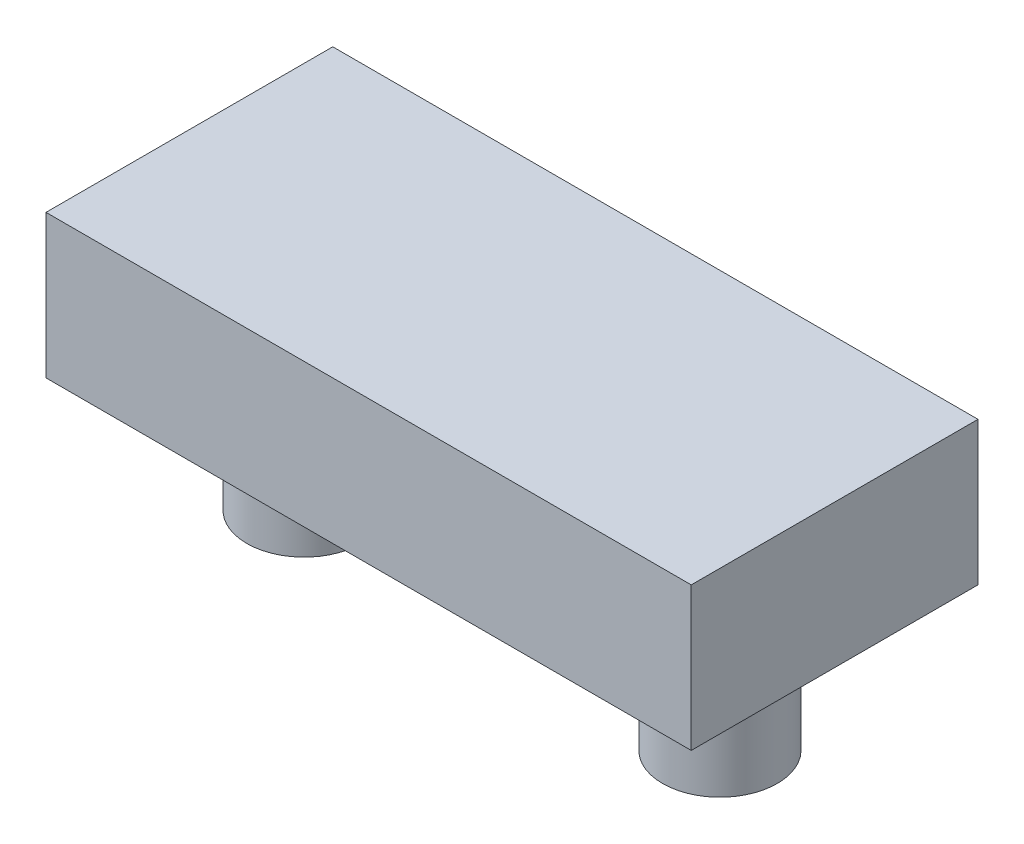
ISO-10303-21;
HEADER;
FILE_DESCRIPTION(('STEP AP214'),'2;1');
FILE_NAME('part.step','',(''),(''),'','','');
FILE_SCHEMA(('AUTOMOTIVE_DESIGN { 1 0 10303 214 1 1 1 1 }'));
ENDSEC;
DATA;
#1=APPLICATION_CONTEXT('core data for automotive mechanical design processes');
#2=APPLICATION_PROTOCOL_DEFINITION('international standard','automotive_design',2000,#1);
#3=PRODUCT_CONTEXT('',#1,'mechanical');
#4=PRODUCT('Part','Part','',(#3));
#5=PRODUCT_RELATED_PRODUCT_CATEGORY('part','',(#4));
#6=PRODUCT_DEFINITION_FORMATION('','',#4);
#7=PRODUCT_DEFINITION_CONTEXT('part definition',#1,'design');
#8=PRODUCT_DEFINITION('design','',#6,#7);
#9=PRODUCT_DEFINITION_SHAPE('','',#8);
#10=(LENGTH_UNIT() NAMED_UNIT(*) SI_UNIT(.MILLI.,.METRE.));
#11=(NAMED_UNIT(*) PLANE_ANGLE_UNIT() SI_UNIT($,.RADIAN.));
#12=(NAMED_UNIT(*) SI_UNIT($,.STERADIAN.) SOLID_ANGLE_UNIT());
#13=UNCERTAINTY_MEASURE_WITH_UNIT(LENGTH_MEASURE(1.E-05),#10,'distance_accuracy_value','');
#14=(GEOMETRIC_REPRESENTATION_CONTEXT(3) GLOBAL_UNCERTAINTY_ASSIGNED_CONTEXT((#13)) GLOBAL_UNIT_ASSIGNED_CONTEXT((#10,
#11,#12)) REPRESENTATION_CONTEXT('',''));
#15=CARTESIAN_POINT('',(0.,0.,0.));
#16=DIRECTION('',(0.,0.,1.));
#17=DIRECTION('',(1.,0.,0.));
#18=AXIS2_PLACEMENT_3D('',#15,#16,#17);
#19=CARTESIAN_POINT('',(0.,640.,200.));
#20=DIRECTION('',(1.,0.,0.));
#21=DIRECTION('',(0.,1.,0.));
#22=AXIS2_PLACEMENT_3D('',#19,#20,#21);
#23=PLANE('',#22);
#24=DIRECTION('',(0.,-1.,0.));
#25=VECTOR('',#24,1.);
#26=CARTESIAN_POINT('',(0.,640.,0.));
#27=LINE('',#26,#25);
#28=CARTESIAN_POINT('',(0.,640.,0.));
#29=VERTEX_POINT('',#28);
#30=CARTESIAN_POINT('',(0.,540.,0.));
#31=VERTEX_POINT('',#30);
#32=EDGE_CURVE('E100',#29,#31,#27,.T.);
#33=ORIENTED_EDGE('',*,*,#32,.T.);
#34=DIRECTION('',(0.,0.,-1.));
#35=VECTOR('',#34,1.);
#36=CARTESIAN_POINT('',(0.,540.,200.));
#37=LINE('',#36,#35);
#38=CARTESIAN_POINT('',(0.,540.,200.));
#39=VERTEX_POINT('',#38);
#40=EDGE_CURVE('E91',#39,#31,#37,.T.);
#41=ORIENTED_EDGE('',*,*,#40,.F.);
#42=DIRECTION('',(0.,-1.,0.));
#43=VECTOR('',#42,1.);
#44=CARTESIAN_POINT('',(0.,640.,200.));
#45=LINE('',#44,#43);
#46=CARTESIAN_POINT('',(0.,640.,200.));
#47=VERTEX_POINT('',#46);
#48=EDGE_CURVE('E85',#47,#39,#45,.T.);
#49=ORIENTED_EDGE('',*,*,#48,.F.);
#50=DIRECTION('',(0.,0.,-1.));
#51=VECTOR('',#50,1.);
#52=CARTESIAN_POINT('',(0.,640.,200.));
#53=LINE('',#52,#51);
#54=EDGE_CURVE('E96',#47,#29,#53,.T.);
#55=ORIENTED_EDGE('',*,*,#54,.T.);
#56=EDGE_LOOP('',(#33,#41,#49,#55));
#57=FACE_BOUND('',#56,.T.);
#58=ADVANCED_FACE('F33',(#57),#23,.F.);
#59=CARTESIAN_POINT('',(0.,540.,200.));
#60=DIRECTION('',(0.,1.,0.));
#61=DIRECTION('',(0.,0.,1.));
#62=AXIS2_PLACEMENT_3D('',#59,#60,#61);
#63=PLANE('',#62);
#64=CARTESIAN_POINT('',(370.,540.,100.));
#65=DIRECTION('',(0.,1.,0.));
#66=DIRECTION('',(0.,0.,1.));
#67=AXIS2_PLACEMENT_3D('',#64,#65,#66);
#68=CIRCLE('',#67,40.);
#69=CARTESIAN_POINT('',(370.,540.,140.));
#70=VERTEX_POINT('',#69);
#71=EDGE_CURVE('E11',#70,#70,#68,.F.);
#72=ORIENTED_EDGE('',*,*,#71,.F.);
#73=EDGE_LOOP('',(#72));
#74=FACE_BOUND('',#73,.T.);
#75=CARTESIAN_POINT('',(80.,540.,100.));
#76=DIRECTION('',(0.,1.,0.));
#77=DIRECTION('',(0.,0.,1.));
#78=AXIS2_PLACEMENT_3D('',#75,#76,#77);
#79=CIRCLE('',#78,40.);
#80=CARTESIAN_POINT('',(80.,540.,140.));
#81=VERTEX_POINT('',#80);
#82=EDGE_CURVE('E41',#81,#81,#79,.F.);
#83=ORIENTED_EDGE('',*,*,#82,.F.);
#84=EDGE_LOOP('',(#83));
#85=FACE_BOUND('',#84,.T.);
#86=DIRECTION('',(1.,0.,0.));
#87=VECTOR('',#86,1.);
#88=CARTESIAN_POINT('',(0.,540.,0.));
#89=LINE('',#88,#87);
#90=CARTESIAN_POINT('',(450.,540.,0.));
#91=VERTEX_POINT('',#90);
#92=EDGE_CURVE('E90',#31,#91,#89,.T.);
#93=ORIENTED_EDGE('',*,*,#92,.T.);
#94=DIRECTION('',(0.,0.,-1.));
#95=VECTOR('',#94,1.);
#96=CARTESIAN_POINT('',(450.,540.,200.));
#97=LINE('',#96,#95);
#98=CARTESIAN_POINT('',(450.,540.,200.));
#99=VERTEX_POINT('',#98);
#100=EDGE_CURVE('E88',#99,#91,#97,.T.);
#101=ORIENTED_EDGE('',*,*,#100,.F.);
#102=DIRECTION('',(1.,0.,0.));
#103=VECTOR('',#102,1.);
#104=CARTESIAN_POINT('',(0.,540.,200.));
#105=LINE('',#104,#103);
#106=EDGE_CURVE('E80',#39,#99,#105,.T.);
#107=ORIENTED_EDGE('',*,*,#106,.F.);
#108=ORIENTED_EDGE('',*,*,#40,.T.);
#109=EDGE_LOOP('',(#93,#101,#107,#108));
#110=FACE_BOUND('',#109,.T.);
#111=ADVANCED_FACE('F89',(#74,#85,#110),#63,.F.);
#112=CARTESIAN_POINT('',(450.,640.,200.));
#113=DIRECTION('',(-1.,0.,0.));
#114=DIRECTION('',(0.,0.,1.));
#115=AXIS2_PLACEMENT_3D('',#112,#113,#114);
#116=PLANE('',#115);
#117=DIRECTION('',(0.,1.,0.));
#118=VECTOR('',#117,1.);
#119=CARTESIAN_POINT('',(450.,640.,0.));
#120=LINE('',#119,#118);
#121=CARTESIAN_POINT('',(450.,640.,0.));
#122=VERTEX_POINT('',#121);
#123=EDGE_CURVE('E66',#91,#122,#120,.T.);
#124=ORIENTED_EDGE('',*,*,#123,.T.);
#125=DIRECTION('',(0.,0.,-1.));
#126=VECTOR('',#125,1.);
#127=CARTESIAN_POINT('',(450.,640.,200.));
#128=LINE('',#127,#126);
#129=CARTESIAN_POINT('',(450.,640.,200.));
#130=VERTEX_POINT('',#129);
#131=EDGE_CURVE('E92',#130,#122,#128,.T.);
#132=ORIENTED_EDGE('',*,*,#131,.F.);
#133=DIRECTION('',(0.,1.,0.));
#134=VECTOR('',#133,1.);
#135=CARTESIAN_POINT('',(450.,640.,200.));
#136=LINE('',#135,#134);
#137=EDGE_CURVE('E83',#99,#130,#136,.T.);
#138=ORIENTED_EDGE('',*,*,#137,.F.);
#139=ORIENTED_EDGE('',*,*,#100,.T.);
#140=EDGE_LOOP('',(#124,#132,#138,#139));
#141=FACE_BOUND('',#140,.T.);
#142=ADVANCED_FACE('F94',(#141),#116,.F.);
#143=CARTESIAN_POINT('',(0.,640.,200.));
#144=DIRECTION('',(0.,-1.,0.));
#145=DIRECTION('',(0.,0.,-1.));
#146=AXIS2_PLACEMENT_3D('',#143,#144,#145);
#147=PLANE('',#146);
#148=DIRECTION('',(-1.,0.,0.));
#149=VECTOR('',#148,1.);
#150=CARTESIAN_POINT('',(0.,640.,0.));
#151=LINE('',#150,#149);
#152=EDGE_CURVE('E72',#122,#29,#151,.T.);
#153=ORIENTED_EDGE('',*,*,#152,.T.);
#154=ORIENTED_EDGE('',*,*,#54,.F.);
#155=DIRECTION('',(-1.,0.,0.));
#156=VECTOR('',#155,1.);
#157=CARTESIAN_POINT('',(0.,640.,200.));
#158=LINE('',#157,#156);
#159=EDGE_CURVE('E49',#130,#47,#158,.T.);
#160=ORIENTED_EDGE('',*,*,#159,.F.);
#161=ORIENTED_EDGE('',*,*,#131,.T.);
#162=EDGE_LOOP('',(#153,#154,#160,#161));
#163=FACE_BOUND('',#162,.T.);
#164=ADVANCED_FACE('F121',(#163),#147,.F.);
#165=CARTESIAN_POINT('',(0.,0.,200.));
#166=DIRECTION('',(0.,0.,1.));
#167=DIRECTION('',(1.,0.,0.));
#168=AXIS2_PLACEMENT_3D('',#165,#166,#167);
#169=PLANE('',#168);
#170=ORIENTED_EDGE('',*,*,#48,.T.);
#171=ORIENTED_EDGE('',*,*,#106,.T.);
#172=ORIENTED_EDGE('',*,*,#137,.T.);
#173=ORIENTED_EDGE('',*,*,#159,.T.);
#174=EDGE_LOOP('',(#170,#171,#172,#173));
#175=FACE_BOUND('',#174,.T.);
#176=ADVANCED_FACE('F81',(#175),#169,.T.);
#177=CARTESIAN_POINT('',(0.,0.,0.));
#178=DIRECTION('',(0.,0.,1.));
#179=DIRECTION('',(1.,0.,0.));
#180=AXIS2_PLACEMENT_3D('',#177,#178,#179);
#181=PLANE('',#180);
#182=ORIENTED_EDGE('',*,*,#32,.F.);
#183=ORIENTED_EDGE('',*,*,#152,.F.);
#184=ORIENTED_EDGE('',*,*,#123,.F.);
#185=ORIENTED_EDGE('',*,*,#92,.F.);
#186=EDGE_LOOP('',(#182,#183,#184,#185));
#187=FACE_BOUND('',#186,.T.);
#188=ADVANCED_FACE('F129',(#187),#181,.F.);
#189=CARTESIAN_POINT('',(80.,450.,100.));
#190=DIRECTION('',(0.,1.,0.));
#191=DIRECTION('',(0.,0.,1.));
#192=AXIS2_PLACEMENT_3D('',#189,#190,#191);
#193=CYLINDRICAL_SURFACE('',#192,40.);
#194=CARTESIAN_POINT('',(80.,450.,100.));
#195=DIRECTION('',(0.,-1.,0.));
#196=DIRECTION('',(0.,0.,-1.));
#197=AXIS2_PLACEMENT_3D('',#194,#195,#196);
#198=CIRCLE('',#197,40.);
#199=CARTESIAN_POINT('',(80.,450.,140.));
#200=VERTEX_POINT('',#199);
#201=EDGE_CURVE('E103',#200,#200,#198,.T.);
#202=CARTESIAN_POINT('',(80.,450.,140.));
#203=CARTESIAN_POINT('',(80.,450.9375,140.));
#204=CARTESIAN_POINT('',(80.,451.875,140.));
#205=CARTESIAN_POINT('',(80.,453.75,140.));
#206=CARTESIAN_POINT('',(80.,454.6875,140.));
#207=CARTESIAN_POINT('',(80.,456.5625,140.));
#208=CARTESIAN_POINT('',(80.,457.5,140.));
#209=CARTESIAN_POINT('',(80.,459.375,140.));
#210=CARTESIAN_POINT('',(80.,460.3125,140.));
#211=CARTESIAN_POINT('',(80.,462.1875,140.));
#212=CARTESIAN_POINT('',(80.,463.125,140.));
#213=CARTESIAN_POINT('',(80.,465.,140.));
#214=CARTESIAN_POINT('',(80.,465.9375,140.));
#215=CARTESIAN_POINT('',(80.,467.8125,140.));
#216=CARTESIAN_POINT('',(80.,468.75,140.));
#217=CARTESIAN_POINT('',(80.,470.625,140.));
#218=CARTESIAN_POINT('',(80.,471.5625,140.));
#219=CARTESIAN_POINT('',(80.,473.4375,140.));
#220=CARTESIAN_POINT('',(80.,474.375,140.));
#221=CARTESIAN_POINT('',(80.,476.25,140.));
#222=CARTESIAN_POINT('',(80.,477.1875,140.));
#223=CARTESIAN_POINT('',(80.,479.0625,140.));
#224=CARTESIAN_POINT('',(80.,480.,140.));
#225=CARTESIAN_POINT('',(80.,481.875,140.));
#226=CARTESIAN_POINT('',(80.,482.8125,140.));
#227=CARTESIAN_POINT('',(80.,484.6875,140.));
#228=CARTESIAN_POINT('',(80.,485.625,140.));
#229=CARTESIAN_POINT('',(80.,487.5,140.));
#230=CARTESIAN_POINT('',(80.,488.4375,140.));
#231=CARTESIAN_POINT('',(80.,490.3125,140.));
#232=CARTESIAN_POINT('',(80.,491.25,140.));
#233=CARTESIAN_POINT('',(80.,493.125,140.));
#234=CARTESIAN_POINT('',(80.,494.0625,140.));
#235=CARTESIAN_POINT('',(80.,495.9375,140.));
#236=CARTESIAN_POINT('',(80.,496.875,140.));
#237=CARTESIAN_POINT('',(80.,498.75,140.));
#238=CARTESIAN_POINT('',(80.,499.6875,140.));
#239=CARTESIAN_POINT('',(80.,501.5625,140.));
#240=CARTESIAN_POINT('',(80.,502.5,140.));
#241=CARTESIAN_POINT('',(80.,504.375,140.));
#242=CARTESIAN_POINT('',(80.,505.3125,140.));
#243=CARTESIAN_POINT('',(80.,507.1875,140.));
#244=CARTESIAN_POINT('',(80.,508.125,140.));
#245=CARTESIAN_POINT('',(80.,510.,140.));
#246=CARTESIAN_POINT('',(80.,510.9375,140.));
#247=CARTESIAN_POINT('',(80.,512.8125,140.));
#248=CARTESIAN_POINT('',(80.,513.75,140.));
#249=CARTESIAN_POINT('',(80.,515.625,140.));
#250=CARTESIAN_POINT('',(80.,516.5625,140.));
#251=CARTESIAN_POINT('',(80.,518.4375,140.));
#252=CARTESIAN_POINT('',(80.,519.375,140.));
#253=CARTESIAN_POINT('',(80.,521.25,140.));
#254=CARTESIAN_POINT('',(80.,522.1875,140.));
#255=CARTESIAN_POINT('',(80.,524.0625,140.));
#256=CARTESIAN_POINT('',(80.,525.,140.));
#257=CARTESIAN_POINT('',(80.,526.875,140.));
#258=CARTESIAN_POINT('',(80.,527.8125,140.));
#259=CARTESIAN_POINT('',(80.,529.6875,140.));
#260=CARTESIAN_POINT('',(80.,530.625,140.));
#261=CARTESIAN_POINT('',(80.,532.5,140.));
#262=CARTESIAN_POINT('',(80.,533.4375,140.));
#263=CARTESIAN_POINT('',(80.,535.3125,140.));
#264=CARTESIAN_POINT('',(80.,536.25,140.));
#265=CARTESIAN_POINT('',(80.,538.125,140.));
#266=CARTESIAN_POINT('',(80.,539.0625,140.));
#267=CARTESIAN_POINT('',(80.,540.,140.));
#268=B_SPLINE_CURVE_WITH_KNOTS('',3,(#202,#203,#204,#205,#206,#207,#208,#209,#210,#211,#212,
#213,#214,#215,#216,#217,#218,#219,#220,#221,#222,#223,#224,#225,#226,#227,#228,#229,#230,#231,
#232,#233,#234,#235,#236,#237,#238,#239,#240,#241,#242,#243,#244,#245,#246,#247,#248,#249,#250,
#251,#252,#253,#254,#255,#256,#257,#258,#259,#260,#261,#262,#263,#264,#265,#266,#267),
.UNSPECIFIED.,.F.,.F.,(4,2,2,2,2,2,2,2,2,2,2,2,2,2,2,2,2,2,2,2,2,2,2,2,2,2,2,2,2,2,2,2,4),(0.,
2.81250000000005,5.62500000000005,8.43750000000004,11.25,14.0625,16.875,19.6875,22.5,25.3125,
28.125,30.9375,33.75,36.5625,39.375,42.1875,45.,47.8125,50.6249999999999,53.4374999999999,
56.2499999999999,59.0624999999999,61.8749999999999,64.6874999999999,67.4999999999999,
70.3124999999999,73.1249999999999,75.9374999999999,78.7499999999999,81.5624999999999,
84.3749999999999,87.1874999999999,89.9999999999999),.UNSPECIFIED.);
#269=EDGE_CURVE('BSEAM112',#200,#81,#268,.T.);
#270=ORIENTED_EDGE('',*,*,#201,.F.);
#271=ORIENTED_EDGE('',*,*,#82,.T.);
#272=ORIENTED_EDGE('',*,*,#269,.T.);
#273=ORIENTED_EDGE('',*,*,#269,.F.);
#274=EDGE_LOOP('',(#270,#272,#271,#273));
#275=FACE_BOUND('',#274,.T.);
#276=ADVANCED_FACE('F112',(#275),#193,.T.);
#277=CARTESIAN_POINT('',(80.,450.,100.));
#278=DIRECTION('',(0.,-1.,0.));
#279=DIRECTION('',(0.,0.,-1.));
#280=AXIS2_PLACEMENT_3D('',#277,#278,#279);
#281=PLANE('',#280);
#282=ORIENTED_EDGE('',*,*,#201,.T.);
#283=EDGE_LOOP('',(#282));
#284=FACE_BOUND('',#283,.T.);
#285=ADVANCED_FACE('F137',(#284),#281,.T.);
#286=CARTESIAN_POINT('',(370.,450.,100.));
#287=DIRECTION('',(0.,1.,0.));
#288=DIRECTION('',(0.,0.,1.));
#289=AXIS2_PLACEMENT_3D('',#286,#287,#288);
#290=CYLINDRICAL_SURFACE('',#289,40.);
#291=CARTESIAN_POINT('',(370.,450.,100.));
#292=DIRECTION('',(0.,-1.,0.));
#293=DIRECTION('',(0.,0.,-1.));
#294=AXIS2_PLACEMENT_3D('',#291,#292,#293);
#295=CIRCLE('',#294,40.);
#296=CARTESIAN_POINT('',(370.,450.,140.));
#297=VERTEX_POINT('',#296);
#298=EDGE_CURVE('E153',#297,#297,#295,.T.);
#299=CARTESIAN_POINT('',(370.,450.,140.));
#300=CARTESIAN_POINT('',(370.,450.9375,140.));
#301=CARTESIAN_POINT('',(370.,451.875,140.));
#302=CARTESIAN_POINT('',(370.,453.75,140.));
#303=CARTESIAN_POINT('',(370.,454.6875,140.));
#304=CARTESIAN_POINT('',(370.,456.5625,140.));
#305=CARTESIAN_POINT('',(370.,457.5,140.));
#306=CARTESIAN_POINT('',(370.,459.375,140.));
#307=CARTESIAN_POINT('',(370.,460.3125,140.));
#308=CARTESIAN_POINT('',(370.,462.1875,140.));
#309=CARTESIAN_POINT('',(370.,463.125,140.));
#310=CARTESIAN_POINT('',(370.,465.,140.));
#311=CARTESIAN_POINT('',(370.,465.9375,140.));
#312=CARTESIAN_POINT('',(370.,467.8125,140.));
#313=CARTESIAN_POINT('',(370.,468.75,140.));
#314=CARTESIAN_POINT('',(370.,470.625,140.));
#315=CARTESIAN_POINT('',(370.,471.5625,140.));
#316=CARTESIAN_POINT('',(370.,473.4375,140.));
#317=CARTESIAN_POINT('',(370.,474.375,140.));
#318=CARTESIAN_POINT('',(370.,476.25,140.));
#319=CARTESIAN_POINT('',(370.,477.1875,140.));
#320=CARTESIAN_POINT('',(370.,479.0625,140.));
#321=CARTESIAN_POINT('',(370.,480.,140.));
#322=CARTESIAN_POINT('',(370.,481.875,140.));
#323=CARTESIAN_POINT('',(370.,482.8125,140.));
#324=CARTESIAN_POINT('',(370.,484.6875,140.));
#325=CARTESIAN_POINT('',(370.,485.625,140.));
#326=CARTESIAN_POINT('',(370.,487.5,140.));
#327=CARTESIAN_POINT('',(370.,488.4375,140.));
#328=CARTESIAN_POINT('',(370.,490.3125,140.));
#329=CARTESIAN_POINT('',(370.,491.25,140.));
#330=CARTESIAN_POINT('',(370.,493.125,140.));
#331=CARTESIAN_POINT('',(370.,494.0625,140.));
#332=CARTESIAN_POINT('',(370.,495.9375,140.));
#333=CARTESIAN_POINT('',(370.,496.875,140.));
#334=CARTESIAN_POINT('',(370.,498.75,140.));
#335=CARTESIAN_POINT('',(370.,499.6875,140.));
#336=CARTESIAN_POINT('',(370.,501.5625,140.));
#337=CARTESIAN_POINT('',(370.,502.5,140.));
#338=CARTESIAN_POINT('',(370.,504.375,140.));
#339=CARTESIAN_POINT('',(370.,505.3125,140.));
#340=CARTESIAN_POINT('',(370.,507.1875,140.));
#341=CARTESIAN_POINT('',(370.,508.125,140.));
#342=CARTESIAN_POINT('',(370.,510.,140.));
#343=CARTESIAN_POINT('',(370.,510.9375,140.));
#344=CARTESIAN_POINT('',(370.,512.8125,140.));
#345=CARTESIAN_POINT('',(370.,513.75,140.));
#346=CARTESIAN_POINT('',(370.,515.625,140.));
#347=CARTESIAN_POINT('',(370.,516.5625,140.));
#348=CARTESIAN_POINT('',(370.,518.4375,140.));
#349=CARTESIAN_POINT('',(370.,519.375,140.));
#350=CARTESIAN_POINT('',(370.,521.25,140.));
#351=CARTESIAN_POINT('',(370.,522.1875,140.));
#352=CARTESIAN_POINT('',(370.,524.0625,140.));
#353=CARTESIAN_POINT('',(370.,525.,140.));
#354=CARTESIAN_POINT('',(370.,526.875,140.));
#355=CARTESIAN_POINT('',(370.,527.8125,140.));
#356=CARTESIAN_POINT('',(370.,529.6875,140.));
#357=CARTESIAN_POINT('',(370.,530.625,140.));
#358=CARTESIAN_POINT('',(370.,532.5,140.));
#359=CARTESIAN_POINT('',(370.,533.4375,140.));
#360=CARTESIAN_POINT('',(370.,535.3125,140.));
#361=CARTESIAN_POINT('',(370.,536.25,140.));
#362=CARTESIAN_POINT('',(370.,538.125,140.));
#363=CARTESIAN_POINT('',(370.,539.0625,140.));
#364=CARTESIAN_POINT('',(370.,540.,140.));
#365=B_SPLINE_CURVE_WITH_KNOTS('',3,(#299,#300,#301,#302,#303,#304,#305,#306,#307,#308,#309,
#310,#311,#312,#313,#314,#315,#316,#317,#318,#319,#320,#321,#322,#323,#324,#325,#326,#327,#328,
#329,#330,#331,#332,#333,#334,#335,#336,#337,#338,#339,#340,#341,#342,#343,#344,#345,#346,#347,
#348,#349,#350,#351,#352,#353,#354,#355,#356,#357,#358,#359,#360,#361,#362,#363,#364),
.UNSPECIFIED.,.F.,.F.,(4,2,2,2,2,2,2,2,2,2,2,2,2,2,2,2,2,2,2,2,2,2,2,2,2,2,2,2,2,2,2,2,4),(0.,
2.81250000000005,5.62500000000005,8.43750000000004,11.25,14.0625,16.875,19.6875,22.5,25.3125,
28.125,30.9375,33.75,36.5625,39.375,42.1875,45.,47.8125,50.6249999999999,53.4374999999999,
56.2499999999999,59.0624999999999,61.8749999999999,64.6874999999999,67.4999999999999,
70.3124999999999,73.1249999999999,75.9374999999999,78.7499999999999,81.5624999999999,
84.3749999999999,87.1874999999999,89.9999999999999),.UNSPECIFIED.);
#366=EDGE_CURVE('BSEAM141',#297,#70,#365,.T.);
#367=ORIENTED_EDGE('',*,*,#298,.F.);
#368=ORIENTED_EDGE('',*,*,#71,.T.);
#369=ORIENTED_EDGE('',*,*,#366,.T.);
#370=ORIENTED_EDGE('',*,*,#366,.F.);
#371=EDGE_LOOP('',(#367,#369,#368,#370));
#372=FACE_BOUND('',#371,.T.);
#373=ADVANCED_FACE('F141',(#372),#290,.T.);
#374=CARTESIAN_POINT('',(370.,450.,100.));
#375=DIRECTION('',(0.,-1.,0.));
#376=DIRECTION('',(0.,0.,-1.));
#377=AXIS2_PLACEMENT_3D('',#374,#375,#376);
#378=PLANE('',#377);
#379=ORIENTED_EDGE('',*,*,#298,.T.);
#380=EDGE_LOOP('',(#379));
#381=FACE_BOUND('',#380,.T.);
#382=ADVANCED_FACE('F145',(#381),#378,.T.);
#383=CLOSED_SHELL('',(#58,#111,#142,#164,#176,#188,#276,#285,#373,#382));
#384=MANIFOLD_SOLID_BREP('B2',#383);
#385=ADVANCED_BREP_SHAPE_REPRESENTATION('',(#18,#384),#14);
#386=SHAPE_DEFINITION_REPRESENTATION(#9,#385);
ENDSEC;
END-ISO-10303-21;
